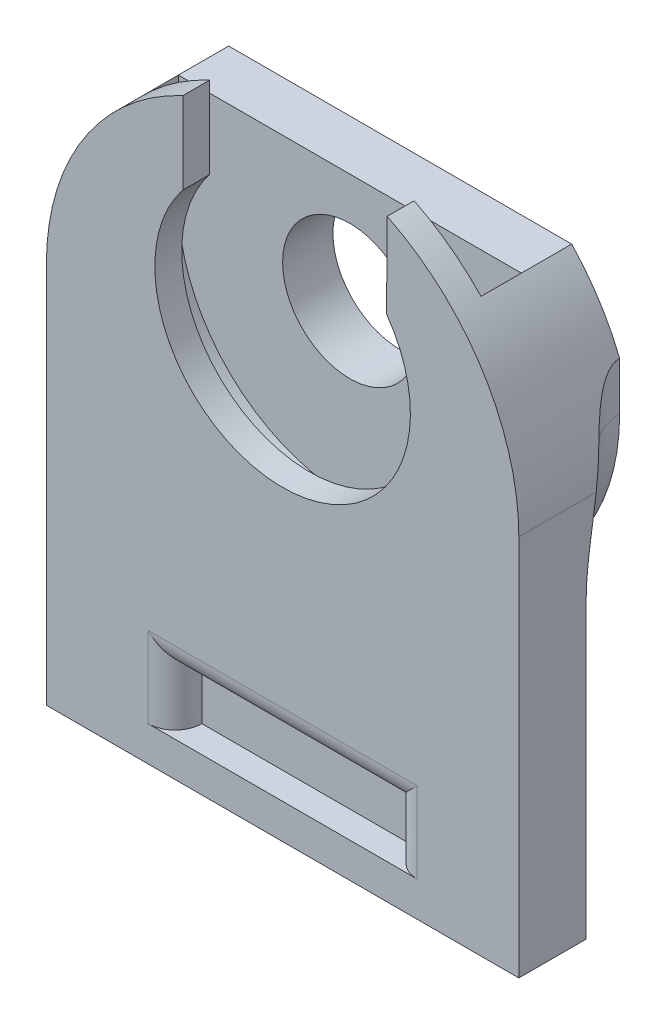
ISO-10303-21;
HEADER;
FILE_DESCRIPTION(('STEP AP214'),'2;1');
FILE_NAME('part.step','',(''),(''),'','','');
FILE_SCHEMA(('AUTOMOTIVE_DESIGN { 1 0 10303 214 1 1 1 1 }'));
ENDSEC;
DATA;
#1=APPLICATION_CONTEXT('core data for automotive mechanical design processes');
#2=APPLICATION_PROTOCOL_DEFINITION('international standard','automotive_design',2000,#1);
#3=PRODUCT_CONTEXT('',#1,'mechanical');
#4=PRODUCT('Part','Part','',(#3));
#5=PRODUCT_RELATED_PRODUCT_CATEGORY('part','',(#4));
#6=PRODUCT_DEFINITION_FORMATION('','',#4);
#7=PRODUCT_DEFINITION_CONTEXT('part definition',#1,'design');
#8=PRODUCT_DEFINITION('design','',#6,#7);
#9=PRODUCT_DEFINITION_SHAPE('','',#8);
#10=(LENGTH_UNIT() NAMED_UNIT(*) SI_UNIT(.MILLI.,.METRE.));
#11=(NAMED_UNIT(*) PLANE_ANGLE_UNIT() SI_UNIT($,.RADIAN.));
#12=(NAMED_UNIT(*) SI_UNIT($,.STERADIAN.) SOLID_ANGLE_UNIT());
#13=UNCERTAINTY_MEASURE_WITH_UNIT(LENGTH_MEASURE(1.E-05),#10,'distance_accuracy_value','');
#14=(GEOMETRIC_REPRESENTATION_CONTEXT(3) GLOBAL_UNCERTAINTY_ASSIGNED_CONTEXT((#13)) GLOBAL_UNIT_ASSIGNED_CONTEXT((#10,
#11,#12)) REPRESENTATION_CONTEXT('',''));
#15=CARTESIAN_POINT('',(0.,0.,0.));
#16=DIRECTION('',(0.,0.,1.));
#17=DIRECTION('',(1.,0.,0.));
#18=AXIS2_PLACEMENT_3D('',#15,#16,#17);
#19=CARTESIAN_POINT('',(8.78,8.5,1.5));
#20=DIRECTION('',(0.,0.,-1.));
#21=DIRECTION('',(-1.,0.,0.));
#22=AXIS2_PLACEMENT_3D('',#19,#20,#21);
#23=CYLINDRICAL_SURFACE('',#22,6.375);
#24=DIRECTION('',(0.,0.,-1.));
#25=VECTOR('',#24,1.);
#26=CARTESIAN_POINT('',(2.405,8.5,15.6427331163393));
#27=LINE('',#26,#25);
#28=CARTESIAN_POINT('',(2.405,8.5,1.5));
#29=VERTEX_POINT('',#28);
#30=CARTESIAN_POINT('',(2.405,8.5,0.));
#31=VERTEX_POINT('',#30);
#32=EDGE_CURVE('E246',#29,#31,#27,.T.);
#33=ORIENTED_EDGE('',*,*,#32,.F.);
#34=CARTESIAN_POINT('',(8.78,8.5,1.5));
#35=DIRECTION('',(0.,0.,1.));
#36=DIRECTION('',(1.,0.,0.));
#37=AXIS2_PLACEMENT_3D('',#34,#35,#36);
#38=CIRCLE('',#37,6.375);
#39=CARTESIAN_POINT('',(15.155,8.49999999999995,1.5));
#40=VERTEX_POINT('',#39);
#41=EDGE_CURVE('E265',#29,#40,#38,.T.);
#42=ORIENTED_EDGE('',*,*,#41,.T.);
#43=DIRECTION('',(0.,0.,-1.));
#44=VECTOR('',#43,1.);
#45=CARTESIAN_POINT('',(15.155,8.49999999999995,15.6427331163393));
#46=LINE('',#45,#44);
#47=CARTESIAN_POINT('',(15.155,8.49999999999995,0.));
#48=VERTEX_POINT('',#47);
#49=EDGE_CURVE('E251',#40,#48,#46,.T.);
#50=ORIENTED_EDGE('',*,*,#49,.T.);
#51=CARTESIAN_POINT('',(8.78,8.5,0.));
#52=DIRECTION('',(0.,0.,1.));
#53=DIRECTION('',(1.,0.,0.));
#54=AXIS2_PLACEMENT_3D('',#51,#52,#53);
#55=CIRCLE('',#54,6.375);
#56=EDGE_CURVE('E297',#31,#48,#55,.T.);
#57=ORIENTED_EDGE('',*,*,#56,.F.);
#58=EDGE_LOOP('',(#33,#42,#50,#57));
#59=FACE_BOUND('',#58,.T.);
#60=ADVANCED_FACE('F35',(#59),#23,.F.);
#61=CARTESIAN_POINT('',(0.,0.,0.));
#62=DIRECTION('',(0.,0.,1.));
#63=DIRECTION('',(1.,0.,0.));
#64=AXIS2_PLACEMENT_3D('',#61,#62,#63);
#65=PLANE('',#64);
#66=DIRECTION('',(1.,0.,0.));
#67=VECTOR('',#66,1.);
#68=CARTESIAN_POINT('',(0.,-1.87,0.));
#69=LINE('',#68,#67);
#70=CARTESIAN_POINT('',(8.62337998923574,-1.87,0.));
#71=VERTEX_POINT('',#70);
#72=CARTESIAN_POINT('',(8.93662001076427,-1.87,0.));
#73=VERTEX_POINT('',#72);
#74=EDGE_CURVE('E362',#71,#73,#69,.T.);
#75=ORIENTED_EDGE('',*,*,#74,.T.);
#76=CARTESIAN_POINT('',(8.93662001076427,8.,0.));
#77=DIRECTION('',(0.,0.,1.));
#78=DIRECTION('',(1.,0.,0.));
#79=AXIS2_PLACEMENT_3D('',#76,#77,#78);
#80=CIRCLE('',#79,9.87);
#81=CARTESIAN_POINT('',(17.56,3.19851923243998,0.));
#82=VERTEX_POINT('',#81);
#83=EDGE_CURVE('E211',#73,#82,#80,.T.);
#84=ORIENTED_EDGE('',*,*,#83,.T.);
#85=DIRECTION('',(0.,1.,0.));
#86=VECTOR('',#85,1.);
#87=CARTESIAN_POINT('',(17.56,0.,0.));
#88=LINE('',#87,#86);
#89=CARTESIAN_POINT('',(17.56,-7.65,0.));
#90=VERTEX_POINT('',#89);
#91=EDGE_CURVE('E301',#90,#82,#88,.T.);
#92=ORIENTED_EDGE('',*,*,#91,.F.);
#93=DIRECTION('',(1.,0.,0.));
#94=VECTOR('',#93,1.);
#95=CARTESIAN_POINT('',(0.,-7.65,0.));
#96=LINE('',#95,#94);
#97=CARTESIAN_POINT('',(0.,-7.65,0.));
#98=VERTEX_POINT('',#97);
#99=EDGE_CURVE('E321',#98,#90,#96,.T.);
#100=ORIENTED_EDGE('',*,*,#99,.F.);
#101=DIRECTION('',(0.,1.,0.));
#102=VECTOR('',#101,1.);
#103=CARTESIAN_POINT('',(0.,0.,0.));
#104=LINE('',#103,#102);
#105=CARTESIAN_POINT('',(0.,3.19851923243999,0.));
#106=VERTEX_POINT('',#105);
#107=EDGE_CURVE('E307',#98,#106,#104,.T.);
#108=ORIENTED_EDGE('',*,*,#107,.T.);
#109=CARTESIAN_POINT('',(8.62337998923574,8.,0.));
#110=DIRECTION('',(0.,0.,1.));
#111=DIRECTION('',(1.,0.,0.));
#112=AXIS2_PLACEMENT_3D('',#109,#110,#111);
#113=CIRCLE('',#112,9.87);
#114=EDGE_CURVE('E360',#106,#71,#113,.T.);
#115=ORIENTED_EDGE('',*,*,#114,.T.);
#116=EDGE_LOOP('',(#75,#84,#92,#100,#108,#115));
#117=FACE_BOUND('',#116,.T.);
#118=ADVANCED_FACE('F435',(#117),#65,.F.);
#119=CARTESIAN_POINT('',(0.,0.,1.5));
#120=DIRECTION('',(0.,0.,1.));
#121=DIRECTION('',(1.,0.,0.));
#122=AXIS2_PLACEMENT_3D('',#119,#120,#121);
#123=PLANE('',#122);
#124=ORIENTED_EDGE('',*,*,#41,.F.);
#125=DIRECTION('',(0.,1.,0.));
#126=VECTOR('',#125,1.);
#127=CARTESIAN_POINT('',(2.405,8.5,1.5));
#128=LINE('',#127,#126);
#129=CARTESIAN_POINT('',(2.405,12.5871992678725,1.5));
#130=VERTEX_POINT('',#129);
#131=EDGE_CURVE('E252',#29,#130,#128,.T.);
#132=ORIENTED_EDGE('',*,*,#131,.T.);
#133=CARTESIAN_POINT('',(8.78,6.55,1.5));
#134=DIRECTION('',(0.,0.,1.));
#135=DIRECTION('',(1.,0.,0.));
#136=AXIS2_PLACEMENT_3D('',#133,#134,#135);
#137=CIRCLE('',#136,8.78);
#138=CARTESIAN_POINT('',(5.07,14.5076566902575,1.5));
#139=VERTEX_POINT('',#138);
#140=EDGE_CURVE('E262',#139,#130,#137,.T.);
#141=ORIENTED_EDGE('',*,*,#140,.F.);
#142=DIRECTION('',(0.,1.,0.));
#143=VECTOR('',#142,1.);
#144=CARTESIAN_POINT('',(5.07,0.,1.5));
#145=LINE('',#144,#143);
#146=CARTESIAN_POINT('',(5.07,11.466209702634,1.5));
#147=VERTEX_POINT('',#146);
#148=EDGE_CURVE('E274',#147,#139,#145,.T.);
#149=ORIENTED_EDGE('',*,*,#148,.F.);
#150=CARTESIAN_POINT('',(8.78,8.5,1.5));
#151=DIRECTION('',(0.,0.,-1.));
#152=DIRECTION('',(-1.,0.,0.));
#153=AXIS2_PLACEMENT_3D('',#150,#151,#152);
#154=CIRCLE('',#153,4.75);
#155=CARTESIAN_POINT('',(12.642805753353,11.2642777920939,1.5));
#156=VERTEX_POINT('',#155);
#157=EDGE_CURVE('E303',#156,#147,#154,.T.);
#158=ORIENTED_EDGE('',*,*,#157,.F.);
#159=DIRECTION('',(-0.00807220354177865,-0.999967419234237,0.));
#160=VECTOR('',#159,1.);
#161=CARTESIAN_POINT('',(12.5510573615878,-0.101317990704999,1.5));
#162=LINE('',#161,#160);
#163=CARTESIAN_POINT('',(12.6682969564391,14.4220738549982,1.5));
#164=VERTEX_POINT('',#163);
#165=EDGE_CURVE('E340',#164,#156,#162,.T.);
#166=ORIENTED_EDGE('',*,*,#165,.F.);
#167=CARTESIAN_POINT('',(8.78,6.55,1.5));
#168=DIRECTION('',(0.,0.,1.));
#169=DIRECTION('',(1.,0.,0.));
#170=AXIS2_PLACEMENT_3D('',#167,#168,#169);
#171=CIRCLE('',#170,8.78);
#172=CARTESIAN_POINT('',(15.155,12.5871992678725,1.5));
#173=VERTEX_POINT('',#172);
#174=EDGE_CURVE('E259',#173,#164,#171,.T.);
#175=ORIENTED_EDGE('',*,*,#174,.F.);
#176=DIRECTION('',(0.,-1.,0.));
#177=VECTOR('',#176,1.);
#178=CARTESIAN_POINT('',(15.155,8.49999999999995,1.5));
#179=LINE('',#178,#177);
#180=EDGE_CURVE('E249',#173,#40,#179,.T.);
#181=ORIENTED_EDGE('',*,*,#180,.T.);
#182=EDGE_LOOP('',(#124,#132,#141,#149,#158,#166,#175,#181));
#183=FACE_BOUND('',#182,.T.);
#184=ADVANCED_FACE('F440',(#183),#123,.F.);
#185=CARTESIAN_POINT('',(0.,0.,2.5));
#186=DIRECTION('',(0.,0.,1.));
#187=DIRECTION('',(1.,0.,0.));
#188=AXIS2_PLACEMENT_3D('',#185,#186,#187);
#189=PLANE('',#188);
#190=DIRECTION('',(0.,1.,0.));
#191=VECTOR('',#190,1.);
#192=CARTESIAN_POINT('',(13.78,-6.35316683145248,2.5));
#193=LINE('',#192,#191);
#194=CARTESIAN_POINT('',(13.78,-3.35316683145248,2.5));
#195=VERTEX_POINT('',#194);
#196=CARTESIAN_POINT('',(13.78,-6.35316683145248,2.5));
#197=VERTEX_POINT('',#196);
#198=EDGE_CURVE('E294',#195,#197,#193,.F.);
#199=ORIENTED_EDGE('',*,*,#198,.T.);
#200=DIRECTION('',(1.,0.,0.));
#201=VECTOR('',#200,1.);
#202=CARTESIAN_POINT('',(12.78,-6.35316683145248,2.5));
#203=LINE('',#202,#201);
#204=CARTESIAN_POINT('',(3.78,-6.35316683145248,2.5));
#205=VERTEX_POINT('',#204);
#206=EDGE_CURVE('E287',#205,#197,#203,.T.);
#207=ORIENTED_EDGE('',*,*,#206,.F.);
#208=DIRECTION('',(0.,-1.,0.));
#209=VECTOR('',#208,1.);
#210=CARTESIAN_POINT('',(3.78,-4.35316683145248,2.5));
#211=LINE('',#210,#209);
#212=CARTESIAN_POINT('',(3.78,-3.35316683145248,2.5));
#213=VERTEX_POINT('',#212);
#214=EDGE_CURVE('E291',#205,#213,#211,.F.);
#215=ORIENTED_EDGE('',*,*,#214,.T.);
#216=DIRECTION('',(-1.,0.,0.));
#217=VECTOR('',#216,1.);
#218=CARTESIAN_POINT('',(12.78,-3.35316683145248,2.5));
#219=LINE('',#218,#217);
#220=EDGE_CURVE('E293',#213,#195,#219,.F.);
#221=ORIENTED_EDGE('',*,*,#220,.T.);
#222=EDGE_LOOP('',(#199,#207,#215,#221));
#223=FACE_BOUND('',#222,.T.);
#224=CARTESIAN_POINT('',(8.78,6.55,2.5));
#225=DIRECTION('',(0.,0.,1.));
#226=DIRECTION('',(1.,0.,0.));
#227=AXIS2_PLACEMENT_3D('',#224,#225,#226);
#228=CIRCLE('',#227,8.78);
#229=CARTESIAN_POINT('',(17.56,6.55,2.5));
#230=VERTEX_POINT('',#229);
#231=CARTESIAN_POINT('',(12.6682969564391,14.4220738549982,2.5));
#232=VERTEX_POINT('',#231);
#233=EDGE_CURVE('E299',#230,#232,#228,.T.);
#234=ORIENTED_EDGE('',*,*,#233,.T.);
#235=DIRECTION('',(-0.00807220354177865,-0.999967419234237,0.));
#236=VECTOR('',#235,1.);
#237=CARTESIAN_POINT('',(12.6696430470026,14.588824693216,2.5));
#238=LINE('',#237,#236);
#239=CARTESIAN_POINT('',(12.642805753353,11.2642777920939,2.5));
#240=VERTEX_POINT('',#239);
#241=EDGE_CURVE('E345',#232,#240,#238,.T.);
#242=ORIENTED_EDGE('',*,*,#241,.T.);
#243=CARTESIAN_POINT('',(8.78,8.5,2.5));
#244=DIRECTION('',(0.,0.,-1.));
#245=DIRECTION('',(-1.,0.,0.));
#246=AXIS2_PLACEMENT_3D('',#243,#244,#245);
#247=CIRCLE('',#246,4.75);
#248=CARTESIAN_POINT('',(5.07,11.466209702634,2.5));
#249=VERTEX_POINT('',#248);
#250=EDGE_CURVE('E317',#240,#249,#247,.T.);
#251=ORIENTED_EDGE('',*,*,#250,.T.);
#252=DIRECTION('',(0.,-1.,0.));
#253=VECTOR('',#252,1.);
#254=CARTESIAN_POINT('',(5.07,14.6194981256581,2.5));
#255=LINE('',#254,#253);
#256=CARTESIAN_POINT('',(5.07,14.5076566902575,2.5));
#257=VERTEX_POINT('',#256);
#258=EDGE_CURVE('E275',#257,#249,#255,.T.);
#259=ORIENTED_EDGE('',*,*,#258,.F.);
#260=CARTESIAN_POINT('',(8.78,6.55,2.5));
#261=DIRECTION('',(0.,0.,1.));
#262=DIRECTION('',(1.,0.,0.));
#263=AXIS2_PLACEMENT_3D('',#260,#261,#262);
#264=CIRCLE('',#263,8.78);
#265=CARTESIAN_POINT('',(0.,6.55,2.5));
#266=VERTEX_POINT('',#265);
#267=EDGE_CURVE('E315',#257,#266,#264,.T.);
#268=ORIENTED_EDGE('',*,*,#267,.T.);
#269=DIRECTION('',(0.,-1.,0.));
#270=VECTOR('',#269,1.);
#271=CARTESIAN_POINT('',(0.,0.,2.5));
#272=LINE('',#271,#270);
#273=CARTESIAN_POINT('',(0.,-7.65,2.5));
#274=VERTEX_POINT('',#273);
#275=EDGE_CURVE('E313',#266,#274,#272,.T.);
#276=ORIENTED_EDGE('',*,*,#275,.T.);
#277=DIRECTION('',(-1.,0.,0.));
#278=VECTOR('',#277,1.);
#279=CARTESIAN_POINT('',(17.56,-7.65,2.5));
#280=LINE('',#279,#278);
#281=CARTESIAN_POINT('',(17.56,-7.65,2.5));
#282=VERTEX_POINT('',#281);
#283=EDGE_CURVE('E306',#282,#274,#280,.T.);
#284=ORIENTED_EDGE('',*,*,#283,.F.);
#285=DIRECTION('',(0.,1.,0.));
#286=VECTOR('',#285,1.);
#287=CARTESIAN_POINT('',(17.56,0.,2.5));
#288=LINE('',#287,#286);
#289=EDGE_CURVE('E310',#282,#230,#288,.T.);
#290=ORIENTED_EDGE('',*,*,#289,.T.);
#291=EDGE_LOOP('',(#234,#242,#251,#259,#268,#276,#284,#290));
#292=FACE_BOUND('',#291,.T.);
#293=ADVANCED_FACE('F502',(#223,#292),#189,.T.);
#294=CARTESIAN_POINT('',(8.78,8.5,2.5));
#295=DIRECTION('',(0.,0.,-1.));
#296=DIRECTION('',(-1.,0.,0.));
#297=AXIS2_PLACEMENT_3D('',#294,#295,#296);
#298=CYLINDRICAL_SURFACE('',#297,4.75);
#299=DIRECTION('',(0.,0.,-1.));
#300=VECTOR('',#299,1.);
#301=CARTESIAN_POINT('',(12.642805753353,11.2642777920939,2.5));
#302=LINE('',#301,#300);
#303=EDGE_CURVE('E270',#156,#240,#302,.F.);
#304=ORIENTED_EDGE('',*,*,#303,.F.);
#305=ORIENTED_EDGE('',*,*,#157,.T.);
#306=DIRECTION('',(0.,0.,-1.));
#307=VECTOR('',#306,1.);
#308=CARTESIAN_POINT('',(5.07,11.466209702634,2.5));
#309=LINE('',#308,#307);
#310=EDGE_CURVE('E271',#249,#147,#309,.T.);
#311=ORIENTED_EDGE('',*,*,#310,.F.);
#312=ORIENTED_EDGE('',*,*,#250,.F.);
#313=EDGE_LOOP('',(#304,#305,#311,#312));
#314=FACE_BOUND('',#313,.T.);
#315=ADVANCED_FACE('F519',(#314),#298,.F.);
#316=CARTESIAN_POINT('',(8.78,6.55,1.5));
#317=DIRECTION('',(0.,0.,-1.));
#318=DIRECTION('',(-1.,0.,0.));
#319=AXIS2_PLACEMENT_3D('',#316,#317,#318);
#320=CYLINDRICAL_SURFACE('',#319,8.78);
#321=DIRECTION('',(0.,0.,-1.));
#322=VECTOR('',#321,1.);
#323=CARTESIAN_POINT('',(17.56,6.55,1.5));
#324=LINE('',#323,#322);
#325=CARTESIAN_POINT('',(17.56,6.55,-0.376678719483411));
#326=VERTEX_POINT('',#325);
#327=EDGE_CURVE('E60',#230,#326,#324,.T.);
#328=ORIENTED_EDGE('',*,*,#327,.T.);
#329=CARTESIAN_POINT('',(17.56,6.55,-0.376678719483445));
#330=CARTESIAN_POINT('',(17.5599995270757,6.66973610895043,-0.391645638041362));
#331=CARTESIAN_POINT('',(17.5575499078055,6.78937435326612,-0.407234810052966));
#332=CARTESIAN_POINT('',(17.5477796873859,7.02826719803863,-0.439768312180382));
#333=CARTESIAN_POINT('',(17.5404590764458,7.14752179772382,-0.456712645020031));
#334=CARTESIAN_POINT('',(17.5113769648211,7.50265410910789,-0.509480760214901));
#335=CARTESIAN_POINT('',(17.4824938257514,7.73769074975735,-0.547459631542807));
#336=CARTESIAN_POINT('',(17.4252609706734,8.08680776670218,-0.609613114176489));
#337=CARTESIAN_POINT('',(17.403878029386,8.20255597991153,-0.631184304066382));
#338=CARTESIAN_POINT('',(17.3565660020954,8.43274105437548,-0.676292366924847));
#339=CARTESIAN_POINT('',(17.3306370498483,8.54717795410703,-0.699829182048639));
#340=CARTESIAN_POINT('',(17.2741373097991,8.77529379375256,-0.749320808993638));
#341=CARTESIAN_POINT('',(17.2435341507939,8.88896117754392,-0.775291953461384));
#342=CARTESIAN_POINT('',(17.1779835134062,9.11438686910083,-0.829954321828415));
#343=CARTESIAN_POINT('',(17.1430355157161,9.22614494684141,-0.858645870780813));
#344=CARTESIAN_POINT('',(17.1059976167678,9.33678375292688,-0.888918915727635));
#345=B_SPLINE_CURVE_WITH_KNOTS('',3,(#329,#330,#331,#332,#333,#334,#335,#336,#337,#338,#339,
#340,#341,#342,#343,#344),.UNSPECIFIED.,.F.,.F.,(4,2,2,2,2,2,2,4),(0.,0.361937073233089,
0.723874873967965,1.44235518697129,1.80127359052817,2.16018143548794,2.52169816000887,
2.8832581356654),.UNSPECIFIED.);
#346=CARTESIAN_POINT('',(17.4394399357002,8.,-0.594179227968167));
#347=VERTEX_POINT('',#346);
#348=EDGE_CURVE('E421',#326,#347,#345,.T.);
#349=ORIENTED_EDGE('',*,*,#348,.T.);
#350=CARTESIAN_POINT('',(17.4394399357002,8.,-0.594179227968167));
#351=CARTESIAN_POINT('',(17.4240201477143,8.09216420853565,-0.610769682800152));
#352=CARTESIAN_POINT('',(17.4071539062772,8.18378186530015,-0.629385465180723));
#353=CARTESIAN_POINT('',(17.3707025917869,8.36571335312294,-0.671721198756279));
#354=CARTESIAN_POINT('',(17.3511058571361,8.45601965287677,-0.69546329646079));
#355=CARTESIAN_POINT('',(17.3092925575907,8.63521764844699,-0.749253197482276));
#356=CARTESIAN_POINT('',(17.2870509499401,8.72408498956349,-0.779363791823925));
#357=CARTESIAN_POINT('',(17.2406307952004,8.89823480536989,-0.847124893146833));
#358=CARTESIAN_POINT('',(17.2164562903784,8.98352422073453,-0.884759899634195));
#359=CARTESIAN_POINT('',(17.1743151520761,9.12440726977741,-0.956947590077173));
#360=CARTESIAN_POINT('',(17.1566336450916,9.18130636882367,-0.989104361592063));
#361=CARTESIAN_POINT('',(17.1211909344294,9.2915831086616,-1.05897252352583));
#362=CARTESIAN_POINT('',(17.1034297727723,9.34496241560316,-1.09668125810504));
#363=CARTESIAN_POINT('',(17.068373053547,9.44727853982594,-1.17904065527757));
#364=CARTESIAN_POINT('',(17.0510839156671,9.49616567799601,-1.22375687224273));
#365=CARTESIAN_POINT('',(17.01835071664,9.58648993397231,-1.32081708956083));
#366=CARTESIAN_POINT('',(17.0029026762309,9.62794322063841,-1.37314407567719));
#367=CARTESIAN_POINT('',(16.9803264253447,9.68746589313267,-1.46628621530755));
#368=CARTESIAN_POINT('',(16.972167404397,9.70866689956173,-1.50483604193031));
#369=CARTESIAN_POINT('',(16.9580262367225,9.74510049921371,-1.58495677437085));
#370=CARTESIAN_POINT('',(16.9520380978151,9.7603495304547,-1.62651897830711));
#371=CARTESIAN_POINT('',(16.9427979178744,9.78377433558673,-1.71214376232688));
#372=CARTESIAN_POINT('',(16.9395570966478,9.79192110827591,-1.75621581858425));
#373=CARTESIAN_POINT('',(16.937069836472,9.798170946207,-1.82316883061139));
#374=CARTESIAN_POINT('',(16.9366410219038,9.79924756714121,-1.84576223675738));
#375=CARTESIAN_POINT('',(16.9366004254851,9.79934870398349,-1.8909715245641));
#376=CARTESIAN_POINT('',(16.936989267409,9.79837165318533,-1.9135874102186));
#377=CARTESIAN_POINT('',(16.9377889452524,9.79636404685565,-1.93610936830708));
#378=B_SPLINE_CURVE_WITH_KNOTS('',3,(#350,#351,#352,#353,#354,#355,#356,#357,#358,#359,#360,
#361,#362,#363,#364,#365,#366,#367,#368,#369,#370,#371,#372,#373,#374,#375,#376,#377),
.UNSPECIFIED.,.F.,.F.,(4,2,2,2,2,2,2,2,2,2,2,2,2,4),(0.,0.284774455255104,0.570804717818058,
0.859798851394684,1.14820367212974,1.3510778292827,1.55385525288111,1.75865736940709,
1.96300848452012,2.09678631662166,2.23019202502451,2.36413996150232,2.43191291380336,
2.49973758753633),.UNSPECIFIED.);
#379=CARTESIAN_POINT('',(16.9366200107643,9.79929992459914,-1.87));
#380=VERTEX_POINT('',#379);
#381=EDGE_CURVE('E372',#347,#380,#378,.T.);
#382=ORIENTED_EDGE('',*,*,#381,.T.);
#383=CARTESIAN_POINT('',(8.78,6.55,-1.87));
#384=DIRECTION('',(0.,0.,-1.));
#385=DIRECTION('',(-1.,0.,0.));
#386=AXIS2_PLACEMENT_3D('',#383,#384,#385);
#387=CIRCLE('',#386,8.78);
#388=CARTESIAN_POINT('',(15.155,12.5871992678725,-1.87));
#389=VERTEX_POINT('',#388);
#390=EDGE_CURVE('E231',#389,#380,#387,.T.);
#391=ORIENTED_EDGE('',*,*,#390,.F.);
#392=DIRECTION('',(0.,0.,1.));
#393=VECTOR('',#392,1.);
#394=CARTESIAN_POINT('',(15.155,12.5871992678725,-1.87));
#395=LINE('',#394,#393);
#396=CARTESIAN_POINT('',(15.155,12.5871992678725,0.));
#397=VERTEX_POINT('',#396);
#398=EDGE_CURVE('E234',#389,#397,#395,.T.);
#399=ORIENTED_EDGE('',*,*,#398,.T.);
#400=DIRECTION('',(0.,0.,-1.));
#401=VECTOR('',#400,1.);
#402=CARTESIAN_POINT('',(15.155,12.5871992678725,1.5));
#403=LINE('',#402,#401);
#404=EDGE_CURVE('E357',#397,#173,#403,.F.);
#405=ORIENTED_EDGE('',*,*,#404,.T.);
#406=ORIENTED_EDGE('',*,*,#174,.T.);
#407=DIRECTION('',(0.,0.,-1.));
#408=VECTOR('',#407,1.);
#409=CARTESIAN_POINT('',(12.6682969564391,14.4220738549982,1.5));
#410=LINE('',#409,#408);
#411=EDGE_CURVE('E266',#232,#164,#410,.T.);
#412=ORIENTED_EDGE('',*,*,#411,.F.);
#413=ORIENTED_EDGE('',*,*,#233,.F.);
#414=EDGE_LOOP('',(#328,#349,#382,#391,#399,#405,#406,#412,#413));
#415=FACE_BOUND('',#414,.T.);
#416=ADVANCED_FACE('F457',(#415),#320,.T.);
#417=CARTESIAN_POINT('',(8.78,6.55,1.5));
#418=DIRECTION('',(0.,0.,-1.));
#419=DIRECTION('',(-1.,0.,0.));
#420=AXIS2_PLACEMENT_3D('',#417,#418,#419);
#421=CYLINDRICAL_SURFACE('',#420,8.78);
#422=DIRECTION('',(0.,0.,-1.));
#423=VECTOR('',#422,1.);
#424=CARTESIAN_POINT('',(5.07,14.5076566902575,1.5));
#425=LINE('',#424,#423);
#426=EDGE_CURVE('E283',#139,#257,#425,.F.);
#427=ORIENTED_EDGE('',*,*,#426,.F.);
#428=ORIENTED_EDGE('',*,*,#140,.T.);
#429=DIRECTION('',(0.,0.,-1.));
#430=VECTOR('',#429,1.);
#431=CARTESIAN_POINT('',(2.405,12.5871992678725,1.5));
#432=LINE('',#431,#430);
#433=CARTESIAN_POINT('',(2.405,12.5871992678725,0.));
#434=VERTEX_POINT('',#433);
#435=EDGE_CURVE('E269',#130,#434,#432,.T.);
#436=ORIENTED_EDGE('',*,*,#435,.T.);
#437=DIRECTION('',(0.,0.,1.));
#438=VECTOR('',#437,1.);
#439=CARTESIAN_POINT('',(2.405,12.5871992678725,-1.87));
#440=LINE('',#439,#438);
#441=CARTESIAN_POINT('',(2.405,12.5871992678725,-1.87));
#442=VERTEX_POINT('',#441);
#443=EDGE_CURVE('E240',#442,#434,#440,.T.);
#444=ORIENTED_EDGE('',*,*,#443,.F.);
#445=CARTESIAN_POINT('',(8.78,6.55,-1.87));
#446=DIRECTION('',(0.,0.,-1.));
#447=DIRECTION('',(-1.,0.,0.));
#448=AXIS2_PLACEMENT_3D('',#445,#446,#447);
#449=CIRCLE('',#448,8.78);
#450=CARTESIAN_POINT('',(0.623379989235738,9.79929992459915,-1.87));
#451=VERTEX_POINT('',#450);
#452=EDGE_CURVE('E226',#451,#442,#449,.T.);
#453=ORIENTED_EDGE('',*,*,#452,.F.);
#454=CARTESIAN_POINT('',(0.623033866597427,9.79843092869827,-1.90597747721005));
#455=CARTESIAN_POINT('',(0.623442370415403,9.79945524004539,-1.88486491867912));
#456=CARTESIAN_POINT('',(0.623488986768873,9.79957333133333,-1.86371294709691));
#457=CARTESIAN_POINT('',(0.622869677325945,9.79801902056514,-1.8214995317798));
#458=CARTESIAN_POINT('',(0.622204237176105,9.79634783885312,-1.80043803616791));
#459=CARTESIAN_POINT('',(0.619175760602193,9.78873130972242,-1.73799171700743));
#460=CARTESIAN_POINT('',(0.615787666868241,9.78020100906049,-1.69694431487049));
#461=CARTESIAN_POINT('',(0.606861429435906,9.75754443636021,-1.61906095887728));
#462=CARTESIAN_POINT('',(0.601443262867247,9.7437296639846,-1.58211698559553));
#463=CARTESIAN_POINT('',(0.588882073529437,9.71137469496746,-1.5106224332813));
#464=CARTESIAN_POINT('',(0.581735746814756,9.69282544299987,-1.4760766039021));
#465=CARTESIAN_POINT('',(0.561184095947379,9.63880865760174,-1.38846974900915));
#466=CARTESIAN_POINT('',(0.546695310160557,9.60009976900076,-1.33766582711242));
#467=CARTESIAN_POINT('',(0.515860515399868,9.51554115735401,-1.24306027886824));
#468=CARTESIAN_POINT('',(0.499509722294968,9.46967292223746,-1.19927741935774));
#469=CARTESIAN_POINT('',(0.468549646337193,9.38021074780859,-1.12401833757293));
#470=CARTESIAN_POINT('',(0.454042946530789,9.33729285201679,-1.09168023180533));
#471=CARTESIAN_POINT('',(0.424923284927993,9.24875421554112,-1.03096854349993));
#472=CARTESIAN_POINT('',(0.4103102502053,9.20313142835776,-1.00259801874435));
#473=CARTESIAN_POINT('',(0.366693047192659,9.06281405379796,-0.922442881584671));
#474=CARTESIAN_POINT('',(0.338032218213679,8.96501595520564,-0.875887225380067));
#475=CARTESIAN_POINT('',(0.291673343280348,8.79542483624635,-0.80618548230568));
#476=CARTESIAN_POINT('',(0.273316165724429,8.72489222036799,-0.780244543534506));
#477=CARTESIAN_POINT('',(0.238051384106603,8.58197497142031,-0.732664672577072));
#478=CARTESIAN_POINT('',(0.221144704815106,8.50958919448339,-0.711028473469209));
#479=CARTESIAN_POINT('',(0.189296706592987,8.36483024049467,-0.671804946148625));
#480=CARTESIAN_POINT('',(0.17432471621075,8.29248180111748,-0.65414987966602));
#481=CARTESIAN_POINT('',(0.146119753087781,8.14687817688715,-0.621954903643266));
#482=CARTESIAN_POINT('',(0.13288412886019,8.07362456594919,-0.607410222527541));
#483=CARTESIAN_POINT('',(0.120560064299782,8.00000000000022,-0.59417922796763));
#484=B_SPLINE_CURVE_WITH_KNOTS('',3,(#454,#455,#456,#457,#458,#459,#460,#461,#462,#463,#464,
#465,#466,#467,#468,#469,#470,#471,#472,#473,#474,#475,#476,#477,#478,#479,#480,#481,#482,#483),
.UNSPECIFIED.,.F.,.F.,(4,2,2,2,2,2,2,2,2,2,2,2,2,2,4),(0.,0.0633796509896781,0.126716102455131,
0.252203234505245,0.37121455038993,0.490455219733195,0.6858093216746,0.88167718861925,
1.04841938121939,1.21528938070553,1.55038452986147,1.78234431444937,2.01445090357376,
2.24224642434578,2.46968994140724),.UNSPECIFIED.);
#485=CARTESIAN_POINT('',(0.12056006429977,8.,-0.594179227968166));
#486=VERTEX_POINT('',#485);
#487=EDGE_CURVE('E365',#451,#486,#484,.T.);
#488=ORIENTED_EDGE('',*,*,#487,.T.);
#489=CARTESIAN_POINT('',(0.,6.55,-0.376678719483442));
#490=CARTESIAN_POINT('',(4.7292425595797E-07,6.66973610895043,-0.391645638041359));
#491=CARTESIAN_POINT('',(0.00245009219449367,6.78937435326612,-0.407234810052963));
#492=CARTESIAN_POINT('',(0.0122203126140926,7.02826719803863,-0.439768312180379));
#493=CARTESIAN_POINT('',(0.0195409235542289,7.14752179772382,-0.456712645020028));
#494=CARTESIAN_POINT('',(0.0486230351789418,7.50265410910789,-0.509480760214898));
#495=CARTESIAN_POINT('',(0.0775061742485578,7.73769074975735,-0.547459631542806));
#496=CARTESIAN_POINT('',(0.134739029326587,8.08680776670218,-0.609613114176486));
#497=CARTESIAN_POINT('',(0.156121970613994,8.20255597991153,-0.631184304066378));
#498=CARTESIAN_POINT('',(0.203433997904639,8.43274105437548,-0.676292366924842));
#499=CARTESIAN_POINT('',(0.229362950151703,8.54717795410702,-0.699829182048635));
#500=CARTESIAN_POINT('',(0.28586269020089,8.77529379375256,-0.749320808993634));
#501=CARTESIAN_POINT('',(0.31646584920608,8.88896117754391,-0.775291953461379));
#502=CARTESIAN_POINT('',(0.382016486593757,9.11438686910083,-0.829954321828409));
#503=CARTESIAN_POINT('',(0.416964484283867,9.22614494684141,-0.858645870780808));
#504=CARTESIAN_POINT('',(0.454002383232218,9.33678375292688,-0.888918915727629));
#505=B_SPLINE_CURVE_WITH_KNOTS('',3,(#489,#490,#491,#492,#493,#494,#495,#496,#497,#498,#499,
#500,#501,#502,#503,#504),.UNSPECIFIED.,.F.,.F.,(4,2,2,2,2,2,2,4),(0.,0.361937073233088,
0.723874873967965,1.44235518697129,1.80127359052817,2.16018143548793,2.52169816000886,
2.8832581356654),.UNSPECIFIED.);
#506=CARTESIAN_POINT('',(0.,6.55,-0.376678719483442));
#507=VERTEX_POINT('',#506);
#508=EDGE_CURVE('E45',#486,#507,#505,.F.);
#509=ORIENTED_EDGE('',*,*,#508,.T.);
#510=DIRECTION('',(0.,0.,-1.));
#511=VECTOR('',#510,1.);
#512=CARTESIAN_POINT('',(0.,6.55,1.5));
#513=LINE('',#512,#511);
#514=EDGE_CURVE('E52',#266,#507,#513,.T.);
#515=ORIENTED_EDGE('',*,*,#514,.F.);
#516=ORIENTED_EDGE('',*,*,#267,.F.);
#517=EDGE_LOOP('',(#427,#428,#436,#444,#453,#488,#509,#515,#516));
#518=FACE_BOUND('',#517,.T.);
#519=ADVANCED_FACE('F378',(#518),#421,.T.);
#520=CARTESIAN_POINT('',(0.,0.,1.5));
#521=DIRECTION('',(-1.,0.,0.));
#522=DIRECTION('',(0.,0.,1.));
#523=AXIS2_PLACEMENT_3D('',#520,#521,#522);
#524=PLANE('',#523);
#525=ORIENTED_EDGE('',*,*,#107,.F.);
#526=DIRECTION('',(0.,0.,-1.));
#527=VECTOR('',#526,1.);
#528=CARTESIAN_POINT('',(0.,-7.65,2.5));
#529=LINE('',#528,#527);
#530=EDGE_CURVE('E324',#274,#98,#529,.T.);
#531=ORIENTED_EDGE('',*,*,#530,.F.);
#532=ORIENTED_EDGE('',*,*,#275,.F.);
#533=ORIENTED_EDGE('',*,*,#514,.T.);
#534=CARTESIAN_POINT('',(0.,9.39003904696931,-0.384072071287627));
#535=CARTESIAN_POINT('',(0.,9.26197247969858,-0.399679876672791));
#536=CARTESIAN_POINT('',(0.,9.13369829176319,-0.413811896130697));
#537=CARTESIAN_POINT('',(0.,8.87674089038296,-0.438273971167934));
#538=CARTESIAN_POINT('',(0.,8.74805753520631,-0.448602520526506));
#539=CARTESIAN_POINT('',(0.,8.49087530581128,-0.464563406720382));
#540=CARTESIAN_POINT('',(0.,8.36237756611873,-0.470213307679686));
#541=CARTESIAN_POINT('',(0.,8.10527939970003,-0.476415158960912));
#542=CARTESIAN_POINT('',(0.,7.97667899515306,-0.476968010682018));
#543=CARTESIAN_POINT('',(0.,7.71973888293138,-0.472929977422504));
#544=CARTESIAN_POINT('',(0.,7.59139906063852,-0.468346202629178));
#545=CARTESIAN_POINT('',(0.,7.33497169591002,-0.454436527698084));
#546=CARTESIAN_POINT('',(0.,7.20688417842772,-0.445110180039807));
#547=CARTESIAN_POINT('',(0.,6.95095790706737,-0.422448494896422));
#548=CARTESIAN_POINT('',(0.,6.82311947918092,-0.409109570601237));
#549=CARTESIAN_POINT('',(0.,6.567792414861,-0.37938784685269));
#550=CARTESIAN_POINT('',(0.,6.44030381136241,-0.363004770148432));
#551=CARTESIAN_POINT('',(0.,6.05469186390594,-0.310403086097381));
#552=CARTESIAN_POINT('',(0.,5.79700314477878,-0.271106844605147));
#553=CARTESIAN_POINT('',(0.,5.28177246158251,-0.193214051394781));
#554=CARTESIAN_POINT('',(0.,5.02423057358671,-0.1546169029282));
#555=CARTESIAN_POINT('',(0.,4.50655667368445,-0.0860171930666329));
#556=CARTESIAN_POINT('',(0.,4.24641814952647,-0.0560589240822136));
#557=CARTESIAN_POINT('',(0.,3.85470519890904,-0.0238138818931742));
#558=CARTESIAN_POINT('',(0.,3.72367611172068,-0.0151773896515326));
#559=CARTESIAN_POINT('',(0.,3.4612888794633,-0.00327597100460445));
#560=CARTESIAN_POINT('',(0.,3.3299305672168,-1.48476736124362E-05));
#561=CARTESIAN_POINT('',(0.,3.19851923243999,0.));
#562=B_SPLINE_CURVE_WITH_KNOTS('',3,(#534,#535,#536,#537,#538,#539,#540,#541,#542,#543,#544,
#545,#546,#547,#548,#549,#550,#551,#552,#553,#554,#555,#556,#557,#558,#559,#560,#561),
.UNSPECIFIED.,.F.,.F.,(4,2,2,2,2,2,2,2,2,2,2,2,2,4),(0.,0.387075974620488,0.774305071644094,
1.16007379500537,1.54577429491654,1.93094156178833,2.31614518071016,2.70169415845081,
3.08727826788895,3.869240559263,4.65050050471543,5.43569758828807,5.82953676990201,
6.22365447338184),.UNSPECIFIED.);
#563=EDGE_CURVE('E11',#507,#106,#562,.T.);
#564=ORIENTED_EDGE('',*,*,#563,.T.);
#565=EDGE_LOOP('',(#525,#531,#532,#533,#564));
#566=FACE_BOUND('',#565,.T.);
#567=ADVANCED_FACE('F406',(#566),#524,.T.);
#568=CARTESIAN_POINT('',(17.56,0.,1.5));
#569=DIRECTION('',(-1.,0.,0.));
#570=DIRECTION('',(0.,0.,1.));
#571=AXIS2_PLACEMENT_3D('',#568,#569,#570);
#572=PLANE('',#571);
#573=ORIENTED_EDGE('',*,*,#91,.T.);
#574=CARTESIAN_POINT('',(17.56,9.39003904696959,-0.384072071287595));
#575=CARTESIAN_POINT('',(17.56,9.26197247969885,-0.399679876672762));
#576=CARTESIAN_POINT('',(17.56,9.13369829176346,-0.413811896130671));
#577=CARTESIAN_POINT('',(17.56,8.87674089038321,-0.438273971167915));
#578=CARTESIAN_POINT('',(17.56,8.74805753520656,-0.448602520526491));
#579=CARTESIAN_POINT('',(17.56,8.49087530581152,-0.464563406720374));
#580=CARTESIAN_POINT('',(17.56,8.36237756611896,-0.470213307679682));
#581=CARTESIAN_POINT('',(17.56,8.10527939970025,-0.476415158960913));
#582=CARTESIAN_POINT('',(17.56,7.97667899515328,-0.476968010682022));
#583=CARTESIAN_POINT('',(17.56,7.71973888293159,-0.472929977422513));
#584=CARTESIAN_POINT('',(17.56,7.59139906063872,-0.468346202629191));
#585=CARTESIAN_POINT('',(17.56,7.33497169591021,-0.454436527698101));
#586=CARTESIAN_POINT('',(17.56,7.20688417842791,-0.445110180039824));
#587=CARTESIAN_POINT('',(17.56,6.95095790706754,-0.422448494896442));
#588=CARTESIAN_POINT('',(17.56,6.82311947918108,-0.409109570601257));
#589=CARTESIAN_POINT('',(17.56,6.56779241486115,-0.379387846852712));
#590=CARTESIAN_POINT('',(17.56,6.44030381136256,-0.363004770148455));
#591=CARTESIAN_POINT('',(17.56,6.05469186390607,-0.310403086097404));
#592=CARTESIAN_POINT('',(17.56,5.7970031447789,-0.271106844605168));
#593=CARTESIAN_POINT('',(17.56,5.28177246158261,-0.193214051394797));
#594=CARTESIAN_POINT('',(17.56,5.02423057358679,-0.154616902928213));
#595=CARTESIAN_POINT('',(17.56,4.50655667368451,-0.0860171930666405));
#596=CARTESIAN_POINT('',(17.56,4.24641814952652,-0.0560589240822188));
#597=CARTESIAN_POINT('',(17.56,3.85470519890907,-0.0238138818931767));
#598=CARTESIAN_POINT('',(17.56,3.7236761117207,-0.0151773896515343));
#599=CARTESIAN_POINT('',(17.56,3.46128887946331,-0.00327597100460504));
#600=CARTESIAN_POINT('',(17.56,3.3299305672168,-1.48476736126511E-05));
#601=CARTESIAN_POINT('',(17.56,3.19851923243998,0.));
#602=B_SPLINE_CURVE_WITH_KNOTS('',3,(#574,#575,#576,#577,#578,#579,#580,#581,#582,#583,#584,
#585,#586,#587,#588,#589,#590,#591,#592,#593,#594,#595,#596,#597,#598,#599,#600,#601),
.UNSPECIFIED.,.F.,.F.,(4,2,2,2,2,2,2,2,2,2,2,2,2,4),(0.,0.387075974620505,0.774305071644128,
1.16007379500542,1.54577429491661,1.93094156178841,2.31614518071026,2.70169415845093,
3.08727826788908,3.86924055926318,4.65050050471564,5.43569758828831,5.82953676990228,
6.22365447338213),.UNSPECIFIED.);
#603=EDGE_CURVE('E417',#82,#326,#602,.F.);
#604=ORIENTED_EDGE('',*,*,#603,.T.);
#605=ORIENTED_EDGE('',*,*,#327,.F.);
#606=ORIENTED_EDGE('',*,*,#289,.F.);
#607=DIRECTION('',(0.,0.,1.));
#608=VECTOR('',#607,1.);
#609=CARTESIAN_POINT('',(17.56,-7.65,0.));
#610=LINE('',#609,#608);
#611=EDGE_CURVE('E318',#90,#282,#610,.T.);
#612=ORIENTED_EDGE('',*,*,#611,.F.);
#613=EDGE_LOOP('',(#573,#604,#605,#606,#612));
#614=FACE_BOUND('',#613,.T.);
#615=ADVANCED_FACE('F410',(#614),#572,.F.);
#616=CARTESIAN_POINT('',(0.,-7.65,0.));
#617=DIRECTION('',(0.,-1.,0.));
#618=DIRECTION('',(0.,0.,-1.));
#619=AXIS2_PLACEMENT_3D('',#616,#617,#618);
#620=PLANE('',#619);
#621=ORIENTED_EDGE('',*,*,#283,.T.);
#622=ORIENTED_EDGE('',*,*,#530,.T.);
#623=ORIENTED_EDGE('',*,*,#99,.T.);
#624=ORIENTED_EDGE('',*,*,#611,.T.);
#625=EDGE_LOOP('',(#621,#622,#623,#624));
#626=FACE_BOUND('',#625,.T.);
#627=ADVANCED_FACE('F414',(#626),#620,.T.);
#628=CARTESIAN_POINT('',(12.78,-6.35316683145248,1.5));
#629=DIRECTION('',(0.,-1.,0.));
#630=DIRECTION('',(1.,0.,0.));
#631=AXIS2_PLACEMENT_3D('',#628,#629,#630);
#632=PLANE('',#631);
#633=ORIENTED_EDGE('',*,*,#206,.T.);
#634=CARTESIAN_POINT('',(13.78,-6.35316683145248,1.5));
#635=DIRECTION('',(0.,-1.,0.));
#636=DIRECTION('',(1.,0.,0.));
#637=AXIS2_PLACEMENT_3D('',#634,#635,#636);
#638=CIRCLE('',#637,1.);
#639=CARTESIAN_POINT('',(12.78,-6.35316683145248,1.5));
#640=VERTEX_POINT('',#639);
#641=EDGE_CURVE('E284',#197,#640,#638,.T.);
#642=ORIENTED_EDGE('',*,*,#641,.T.);
#643=DIRECTION('',(1.,0.,0.));
#644=VECTOR('',#643,1.);
#645=CARTESIAN_POINT('',(12.78,-6.35316683145248,1.5));
#646=LINE('',#645,#644);
#647=CARTESIAN_POINT('',(4.78,-6.35316683145248,1.5));
#648=VERTEX_POINT('',#647);
#649=EDGE_CURVE('E280',#648,#640,#646,.T.);
#650=ORIENTED_EDGE('',*,*,#649,.F.);
#651=CARTESIAN_POINT('',(3.78,-6.35316683145248,1.5));
#652=DIRECTION('',(0.,-1.,0.));
#653=DIRECTION('',(1.,0.,0.));
#654=AXIS2_PLACEMENT_3D('',#651,#652,#653);
#655=CIRCLE('',#654,1.);
#656=EDGE_CURVE('E286',#648,#205,#655,.T.);
#657=ORIENTED_EDGE('',*,*,#656,.T.);
#658=EDGE_LOOP('',(#633,#642,#650,#657));
#659=FACE_BOUND('',#658,.T.);
#660=ADVANCED_FACE('F508',(#659),#632,.F.);
#661=CARTESIAN_POINT('',(0.,0.,1.5));
#662=DIRECTION('',(0.,0.,1.));
#663=DIRECTION('',(1.,0.,0.));
#664=AXIS2_PLACEMENT_3D('',#661,#662,#663);
#665=PLANE('',#664);
#666=DIRECTION('',(0.,1.,0.));
#667=VECTOR('',#666,1.);
#668=CARTESIAN_POINT('',(12.78,-6.35316683145248,1.5));
#669=LINE('',#668,#667);
#670=CARTESIAN_POINT('',(12.78,-4.35316683145248,1.5));
#671=VERTEX_POINT('',#670);
#672=EDGE_CURVE('E290',#640,#671,#669,.T.);
#673=ORIENTED_EDGE('',*,*,#672,.T.);
#674=DIRECTION('',(-1.,0.,0.));
#675=VECTOR('',#674,1.);
#676=CARTESIAN_POINT('',(12.78,-4.35316683145248,1.5));
#677=LINE('',#676,#675);
#678=CARTESIAN_POINT('',(4.78,-4.35316683145248,1.5));
#679=VERTEX_POINT('',#678);
#680=EDGE_CURVE('E335',#671,#679,#677,.T.);
#681=ORIENTED_EDGE('',*,*,#680,.T.);
#682=DIRECTION('',(0.,-1.,0.));
#683=VECTOR('',#682,1.);
#684=CARTESIAN_POINT('',(4.78,-6.35316683145248,1.5));
#685=LINE('',#684,#683);
#686=EDGE_CURVE('E332',#679,#648,#685,.T.);
#687=ORIENTED_EDGE('',*,*,#686,.T.);
#688=ORIENTED_EDGE('',*,*,#649,.T.);
#689=EDGE_LOOP('',(#673,#681,#687,#688));
#690=FACE_BOUND('',#689,.T.);
#691=ADVANCED_FACE('F481',(#690),#665,.T.);
#692=CARTESIAN_POINT('',(13.78,-6.35316683145248,1.5));
#693=DIRECTION('',(0.,-1.,0.));
#694=DIRECTION('',(0.,0.,-1.));
#695=AXIS2_PLACEMENT_3D('',#692,#693,#694);
#696=CYLINDRICAL_SURFACE('',#695,1.);
#697=ORIENTED_EDGE('',*,*,#641,.F.);
#698=ORIENTED_EDGE('',*,*,#198,.F.);
#699=CARTESIAN_POINT('',(13.78,-3.35316683145248,1.5));
#700=DIRECTION('',(0.707106781186547,-0.707106781186547,0.));
#701=DIRECTION('',(-0.707106781186547,-0.707106781186547,0.));
#702=AXIS2_PLACEMENT_3D('',#699,#700,#701);
#703=ELLIPSE('',#702,1.41421356237309,1.);
#704=EDGE_CURVE('E276',#671,#195,#703,.F.);
#705=ORIENTED_EDGE('',*,*,#704,.F.);
#706=ORIENTED_EDGE('',*,*,#672,.F.);
#707=EDGE_LOOP('',(#697,#698,#705,#706));
#708=FACE_BOUND('',#707,.T.);
#709=ADVANCED_FACE('F477',(#708),#696,.T.);
#710=CARTESIAN_POINT('',(12.78,-3.35316683145248,1.5));
#711=DIRECTION('',(1.,0.,0.));
#712=DIRECTION('',(0.,0.,-1.));
#713=AXIS2_PLACEMENT_3D('',#710,#711,#712);
#714=CYLINDRICAL_SURFACE('',#713,1.);
#715=ORIENTED_EDGE('',*,*,#704,.T.);
#716=ORIENTED_EDGE('',*,*,#220,.F.);
#717=CARTESIAN_POINT('',(3.78,-3.35316683145248,1.5));
#718=DIRECTION('',(0.707106781186547,0.707106781186547,0.));
#719=DIRECTION('',(-0.707106781186547,0.707106781186547,0.));
#720=AXIS2_PLACEMENT_3D('',#717,#718,#719);
#721=ELLIPSE('',#720,1.41421356237309,1.);
#722=EDGE_CURVE('E279',#679,#213,#721,.F.);
#723=ORIENTED_EDGE('',*,*,#722,.F.);
#724=ORIENTED_EDGE('',*,*,#680,.F.);
#725=EDGE_LOOP('',(#715,#716,#723,#724));
#726=FACE_BOUND('',#725,.T.);
#727=ADVANCED_FACE('F480',(#726),#714,.T.);
#728=CARTESIAN_POINT('',(3.78,-6.35316683145248,1.5));
#729=DIRECTION('',(0.,1.,0.));
#730=DIRECTION('',(0.,0.,1.));
#731=AXIS2_PLACEMENT_3D('',#728,#729,#730);
#732=CYLINDRICAL_SURFACE('',#731,1.);
#733=ORIENTED_EDGE('',*,*,#722,.T.);
#734=ORIENTED_EDGE('',*,*,#214,.F.);
#735=ORIENTED_EDGE('',*,*,#656,.F.);
#736=ORIENTED_EDGE('',*,*,#686,.F.);
#737=EDGE_LOOP('',(#733,#734,#735,#736));
#738=FACE_BOUND('',#737,.T.);
#739=ADVANCED_FACE('F484',(#738),#732,.T.);
#740=CARTESIAN_POINT('',(5.07,0.,0.));
#741=DIRECTION('',(1.,0.,0.));
#742=DIRECTION('',(0.,0.,-1.));
#743=AXIS2_PLACEMENT_3D('',#740,#741,#742);
#744=PLANE('',#743);
#745=ORIENTED_EDGE('',*,*,#148,.T.);
#746=ORIENTED_EDGE('',*,*,#426,.T.);
#747=ORIENTED_EDGE('',*,*,#258,.T.);
#748=ORIENTED_EDGE('',*,*,#310,.T.);
#749=EDGE_LOOP('',(#745,#746,#747,#748));
#750=FACE_BOUND('',#749,.T.);
#751=ADVANCED_FACE('F487',(#750),#744,.T.);
#752=CARTESIAN_POINT('',(12.5516314824536,-0.0301971179980865,0.));
#753=DIRECTION('',(-0.999967419234237,0.00807220354177865,0.));
#754=DIRECTION('',(0.,0.,-1.));
#755=AXIS2_PLACEMENT_3D('',#752,#753,#754);
#756=PLANE('',#755);
#757=ORIENTED_EDGE('',*,*,#411,.T.);
#758=ORIENTED_EDGE('',*,*,#165,.T.);
#759=ORIENTED_EDGE('',*,*,#303,.T.);
#760=ORIENTED_EDGE('',*,*,#241,.F.);
#761=EDGE_LOOP('',(#757,#758,#759,#760));
#762=FACE_BOUND('',#761,.T.);
#763=ADVANCED_FACE('F474',(#762),#756,.T.);
#764=CARTESIAN_POINT('',(15.155,8.49999999999995,15.6427331163393));
#765=DIRECTION('',(1.,0.,0.));
#766=DIRECTION('',(0.,0.,-1.));
#767=AXIS2_PLACEMENT_3D('',#764,#765,#766);
#768=PLANE('',#767);
#769=DIRECTION('',(0.,-1.,0.));
#770=VECTOR('',#769,1.);
#771=CARTESIAN_POINT('',(15.155,8.49999999999995,0.));
#772=LINE('',#771,#770);
#773=EDGE_CURVE('E242',#397,#48,#772,.T.);
#774=ORIENTED_EDGE('',*,*,#773,.T.);
#775=ORIENTED_EDGE('',*,*,#49,.F.);
#776=ORIENTED_EDGE('',*,*,#180,.F.);
#777=ORIENTED_EDGE('',*,*,#404,.F.);
#778=EDGE_LOOP('',(#774,#775,#776,#777));
#779=FACE_BOUND('',#778,.T.);
#780=ADVANCED_FACE('F452',(#779),#768,.F.);
#781=CARTESIAN_POINT('',(2.405,8.5,15.6427331163393));
#782=DIRECTION('',(-1.,0.,0.));
#783=DIRECTION('',(0.,-1.,0.));
#784=AXIS2_PLACEMENT_3D('',#781,#782,#783);
#785=PLANE('',#784);
#786=ORIENTED_EDGE('',*,*,#131,.F.);
#787=ORIENTED_EDGE('',*,*,#32,.T.);
#788=DIRECTION('',(0.,1.,0.));
#789=VECTOR('',#788,1.);
#790=CARTESIAN_POINT('',(2.405,8.5,0.));
#791=LINE('',#790,#789);
#792=EDGE_CURVE('E243',#31,#434,#791,.T.);
#793=ORIENTED_EDGE('',*,*,#792,.T.);
#794=ORIENTED_EDGE('',*,*,#435,.F.);
#795=EDGE_LOOP('',(#786,#787,#793,#794));
#796=FACE_BOUND('',#795,.T.);
#797=ADVANCED_FACE('F466',(#796),#785,.F.);
#798=CARTESIAN_POINT('',(0.,12.5871992678725,-1.87));
#799=DIRECTION('',(0.,1.,0.));
#800=DIRECTION('',(-1.,0.,0.));
#801=AXIS2_PLACEMENT_3D('',#798,#799,#800);
#802=PLANE('',#801);
#803=DIRECTION('',(-1.,0.,0.));
#804=VECTOR('',#803,1.);
#805=CARTESIAN_POINT('',(0.,12.5871992678725,0.));
#806=LINE('',#805,#804);
#807=EDGE_CURVE('E204',#397,#434,#806,.T.);
#808=ORIENTED_EDGE('',*,*,#807,.F.);
#809=ORIENTED_EDGE('',*,*,#398,.F.);
#810=DIRECTION('',(-1.,0.,0.));
#811=VECTOR('',#810,1.);
#812=CARTESIAN_POINT('',(0.,12.5871992678725,-1.87));
#813=LINE('',#812,#811);
#814=EDGE_CURVE('E228',#389,#442,#813,.T.);
#815=ORIENTED_EDGE('',*,*,#814,.T.);
#816=ORIENTED_EDGE('',*,*,#443,.T.);
#817=EDGE_LOOP('',(#808,#809,#815,#816));
#818=FACE_BOUND('',#817,.T.);
#819=ADVANCED_FACE('F460',(#818),#802,.T.);
#820=CARTESIAN_POINT('',(0.,0.,-1.87));
#821=DIRECTION('',(0.,0.,-1.));
#822=DIRECTION('',(-1.,0.,0.));
#823=AXIS2_PLACEMENT_3D('',#820,#821,#822);
#824=PLANE('',#823);
#825=CARTESIAN_POINT('',(8.78,8.5,-1.87));
#826=DIRECTION('',(0.,0.,-1.));
#827=DIRECTION('',(-1.,0.,0.));
#828=AXIS2_PLACEMENT_3D('',#825,#826,#827);
#829=CIRCLE('',#828,2.5);
#830=CARTESIAN_POINT('',(6.28,8.5,-1.87));
#831=VERTEX_POINT('',#830);
#832=EDGE_CURVE('E726',#831,#831,#829,.T.);
#833=ORIENTED_EDGE('',*,*,#832,.F.);
#834=EDGE_LOOP('',(#833));
#835=FACE_BOUND('',#834,.T.);
#836=CARTESIAN_POINT('',(8.93662001076427,8.,-1.87));
#837=DIRECTION('',(0.,0.,-1.));
#838=DIRECTION('',(-1.,0.,0.));
#839=AXIS2_PLACEMENT_3D('',#836,#837,#838);
#840=CIRCLE('',#839,8.);
#841=CARTESIAN_POINT('',(8.93662001076427,0.,-1.87));
#842=VERTEX_POINT('',#841);
#843=CARTESIAN_POINT('',(16.9366200107643,8.,-1.87));
#844=VERTEX_POINT('',#843);
#845=EDGE_CURVE('E192',#842,#844,#840,.F.);
#846=ORIENTED_EDGE('',*,*,#845,.F.);
#847=DIRECTION('',(1.,0.,0.));
#848=VECTOR('',#847,1.);
#849=CARTESIAN_POINT('',(0.,0.,-1.87));
#850=LINE('',#849,#848);
#851=CARTESIAN_POINT('',(8.62337998923574,0.,-1.87));
#852=VERTEX_POINT('',#851);
#853=EDGE_CURVE('E196',#852,#842,#850,.T.);
#854=ORIENTED_EDGE('',*,*,#853,.F.);
#855=CARTESIAN_POINT('',(8.62337998923574,8.,-1.87));
#856=DIRECTION('',(0.,0.,-1.));
#857=DIRECTION('',(-1.,0.,0.));
#858=AXIS2_PLACEMENT_3D('',#855,#856,#857);
#859=CIRCLE('',#858,8.);
#860=CARTESIAN_POINT('',(0.623379989235737,8.,-1.87));
#861=VERTEX_POINT('',#860);
#862=EDGE_CURVE('E218',#861,#852,#859,.F.);
#863=ORIENTED_EDGE('',*,*,#862,.F.);
#864=DIRECTION('',(0.,-1.,0.));
#865=VECTOR('',#864,1.);
#866=CARTESIAN_POINT('',(0.62337998923574,0.,-1.87));
#867=LINE('',#866,#865);
#868=EDGE_CURVE('E220',#451,#861,#867,.T.);
#869=ORIENTED_EDGE('',*,*,#868,.F.);
#870=ORIENTED_EDGE('',*,*,#452,.T.);
#871=ORIENTED_EDGE('',*,*,#814,.F.);
#872=ORIENTED_EDGE('',*,*,#390,.T.);
#873=DIRECTION('',(0.,1.,0.));
#874=VECTOR('',#873,1.);
#875=CARTESIAN_POINT('',(16.9366200107643,0.,-1.87));
#876=LINE('',#875,#874);
#877=EDGE_CURVE('E200',#844,#380,#876,.T.);
#878=ORIENTED_EDGE('',*,*,#877,.F.);
#879=EDGE_LOOP('',(#846,#854,#863,#869,#870,#871,#872,#878));
#880=FACE_BOUND('',#879,.T.);
#881=ADVANCED_FACE('F194',(#835,#880),#824,.T.);
#882=CARTESIAN_POINT('',(0.,0.,0.));
#883=DIRECTION('',(0.,0.,-1.));
#884=DIRECTION('',(-1.,0.,0.));
#885=AXIS2_PLACEMENT_3D('',#882,#883,#884);
#886=PLANE('',#885);
#887=CARTESIAN_POINT('',(8.78,8.5,0.));
#888=DIRECTION('',(0.,0.,-1.));
#889=DIRECTION('',(-1.,0.,0.));
#890=AXIS2_PLACEMENT_3D('',#887,#888,#889);
#891=CIRCLE('',#890,2.5);
#892=CARTESIAN_POINT('',(6.28,8.5,0.));
#893=VERTEX_POINT('',#892);
#894=EDGE_CURVE('E237',#893,#893,#891,.F.);
#895=ORIENTED_EDGE('',*,*,#894,.F.);
#896=EDGE_LOOP('',(#895));
#897=FACE_BOUND('',#896,.T.);
#898=ORIENTED_EDGE('',*,*,#792,.F.);
#899=ORIENTED_EDGE('',*,*,#56,.T.);
#900=ORIENTED_EDGE('',*,*,#773,.F.);
#901=ORIENTED_EDGE('',*,*,#807,.T.);
#902=EDGE_LOOP('',(#898,#899,#900,#901));
#903=FACE_BOUND('',#902,.T.);
#904=ADVANCED_FACE('F454',(#897,#903),#886,.F.);
#905=CARTESIAN_POINT('',(8.78,8.5,2.501));
#906=DIRECTION('',(0.,0.,-1.));
#907=DIRECTION('',(-1.,0.,0.));
#908=AXIS2_PLACEMENT_3D('',#905,#906,#907);
#909=CYLINDRICAL_SURFACE('',#908,2.5);
#910=ORIENTED_EDGE('',*,*,#832,.T.);
#911=EDGE_LOOP('',(#910));
#912=FACE_BOUND('',#911,.T.);
#913=ORIENTED_EDGE('',*,*,#894,.T.);
#914=EDGE_LOOP('',(#913));
#915=FACE_BOUND('',#914,.T.);
#916=ADVANCED_FACE('F432',(#912,#915),#909,.F.);
#917=CARTESIAN_POINT('',(18.8066200107643,0.,-1.87));
#918=DIRECTION('',(0.,1.,0.));
#919=DIRECTION('',(0.,0.,1.));
#920=AXIS2_PLACEMENT_3D('',#917,#918,#919);
#921=CYLINDRICAL_SURFACE('',#920,1.87);
#922=ORIENTED_EDGE('',*,*,#877,.T.);
#923=ORIENTED_EDGE('',*,*,#381,.F.);
#924=CARTESIAN_POINT('',(18.8066200107643,8.,-1.87));
#925=DIRECTION('',(0.,1.,0.));
#926=DIRECTION('',(0.,0.,1.));
#927=AXIS2_PLACEMENT_3D('',#924,#925,#926);
#928=CIRCLE('',#927,1.87);
#929=EDGE_CURVE('E40',#844,#347,#928,.T.);
#930=ORIENTED_EDGE('',*,*,#929,.F.);
#931=EDGE_LOOP('',(#922,#923,#930));
#932=FACE_BOUND('',#931,.T.);
#933=ADVANCED_FACE('F37',(#932),#921,.F.);
#934=CARTESIAN_POINT('',(8.93662001076427,8.,-1.87));
#935=DIRECTION('',(0.,0.,1.));
#936=DIRECTION('',(1.,0.,0.));
#937=AXIS2_PLACEMENT_3D('',#934,#935,#936);
#938=TOROIDAL_SURFACE('',#937,9.87,1.87);
#939=ORIENTED_EDGE('',*,*,#603,.F.);
#940=ORIENTED_EDGE('',*,*,#83,.F.);
#941=CARTESIAN_POINT('',(8.93662001076427,-1.87,-1.87));
#942=DIRECTION('',(1.,0.,0.));
#943=DIRECTION('',(0.,0.,-1.));
#944=AXIS2_PLACEMENT_3D('',#941,#942,#943);
#945=CIRCLE('',#944,1.87);
#946=EDGE_CURVE('E208',#842,#73,#945,.T.);
#947=ORIENTED_EDGE('',*,*,#946,.F.);
#948=ORIENTED_EDGE('',*,*,#845,.T.);
#949=ORIENTED_EDGE('',*,*,#929,.T.);
#950=ORIENTED_EDGE('',*,*,#348,.F.);
#951=EDGE_LOOP('',(#939,#940,#947,#948,#949,#950));
#952=FACE_BOUND('',#951,.T.);
#953=ADVANCED_FACE('F210',(#952),#938,.F.);
#954=CARTESIAN_POINT('',(0.,-1.87,-1.87));
#955=DIRECTION('',(1.,0.,0.));
#956=DIRECTION('',(0.,1.,0.));
#957=AXIS2_PLACEMENT_3D('',#954,#955,#956);
#958=CYLINDRICAL_SURFACE('',#957,1.87);
#959=ORIENTED_EDGE('',*,*,#946,.T.);
#960=ORIENTED_EDGE('',*,*,#74,.F.);
#961=CARTESIAN_POINT('',(8.62337998923574,-1.87,-1.87));
#962=DIRECTION('',(1.,0.,0.));
#963=DIRECTION('',(0.,0.,-1.));
#964=AXIS2_PLACEMENT_3D('',#961,#962,#963);
#965=CIRCLE('',#964,1.87);
#966=EDGE_CURVE('E214',#852,#71,#965,.T.);
#967=ORIENTED_EDGE('',*,*,#966,.F.);
#968=ORIENTED_EDGE('',*,*,#853,.T.);
#969=EDGE_LOOP('',(#959,#960,#967,#968));
#970=FACE_BOUND('',#969,.T.);
#971=ADVANCED_FACE('F215',(#970),#958,.F.);
#972=CARTESIAN_POINT('',(8.62337998923574,8.,-1.87));
#973=DIRECTION('',(0.,0.,1.));
#974=DIRECTION('',(1.,0.,0.));
#975=AXIS2_PLACEMENT_3D('',#972,#973,#974);
#976=TOROIDAL_SURFACE('',#975,9.87,1.87);
#977=ORIENTED_EDGE('',*,*,#563,.F.);
#978=ORIENTED_EDGE('',*,*,#508,.F.);
#979=CARTESIAN_POINT('',(-1.24662001076426,8.,-1.87));
#980=DIRECTION('',(0.,-1.,0.));
#981=DIRECTION('',(0.,0.,-1.));
#982=AXIS2_PLACEMENT_3D('',#979,#980,#981);
#983=CIRCLE('',#982,1.87);
#984=EDGE_CURVE('E404',#861,#486,#983,.T.);
#985=ORIENTED_EDGE('',*,*,#984,.F.);
#986=ORIENTED_EDGE('',*,*,#862,.T.);
#987=ORIENTED_EDGE('',*,*,#966,.T.);
#988=ORIENTED_EDGE('',*,*,#114,.F.);
#989=EDGE_LOOP('',(#977,#978,#985,#986,#987,#988));
#990=FACE_BOUND('',#989,.T.);
#991=ADVANCED_FACE('F387',(#990),#976,.F.);
#992=CARTESIAN_POINT('',(-1.24662001076426,0.,-1.87));
#993=DIRECTION('',(0.,-1.,0.));
#994=DIRECTION('',(1.,0.,0.));
#995=AXIS2_PLACEMENT_3D('',#992,#993,#994);
#996=CYLINDRICAL_SURFACE('',#995,1.87);
#997=ORIENTED_EDGE('',*,*,#487,.F.);
#998=ORIENTED_EDGE('',*,*,#868,.T.);
#999=ORIENTED_EDGE('',*,*,#984,.T.);
#1000=EDGE_LOOP('',(#997,#998,#999));
#1001=FACE_BOUND('',#1000,.T.);
#1002=ADVANCED_FACE('F382',(#1001),#996,.F.);
#1003=CLOSED_SHELL('',(#60,#118,#184,#293,#315,#416,#519,#567,#615,#627,#660,#691,#709,#727,
#739,#751,#763,#780,#797,#819,#881,#904,#916,#933,#953,#971,#991,#1002));
#1004=MANIFOLD_SOLID_BREP('B2',#1003);
#1005=ADVANCED_BREP_SHAPE_REPRESENTATION('',(#18,#1004),#14);
#1006=SHAPE_DEFINITION_REPRESENTATION(#9,#1005);
ENDSEC;
END-ISO-10303-21;
